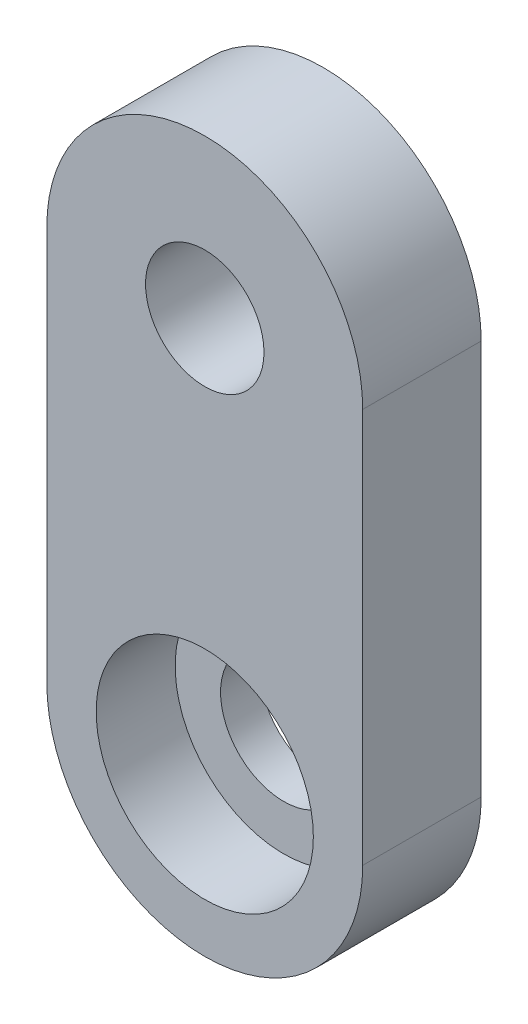
ISO-10303-21;
HEADER;
FILE_DESCRIPTION(('STEP AP214'),'2;1');
FILE_NAME('part.step','',(''),(''),'','','');
FILE_SCHEMA(('AUTOMOTIVE_DESIGN { 1 0 10303 214 1 1 1 1 }'));
ENDSEC;
DATA;
#1=APPLICATION_CONTEXT('core data for automotive mechanical design processes');
#2=APPLICATION_PROTOCOL_DEFINITION('international standard','automotive_design',2000,#1);
#3=PRODUCT_CONTEXT('',#1,'mechanical');
#4=PRODUCT('Part','Part','',(#3));
#5=PRODUCT_RELATED_PRODUCT_CATEGORY('part','',(#4));
#6=PRODUCT_DEFINITION_FORMATION('','',#4);
#7=PRODUCT_DEFINITION_CONTEXT('part definition',#1,'design');
#8=PRODUCT_DEFINITION('design','',#6,#7);
#9=PRODUCT_DEFINITION_SHAPE('','',#8);
#10=(LENGTH_UNIT() NAMED_UNIT(*) SI_UNIT(.MILLI.,.METRE.));
#11=(NAMED_UNIT(*) PLANE_ANGLE_UNIT() SI_UNIT($,.RADIAN.));
#12=(NAMED_UNIT(*) SI_UNIT($,.STERADIAN.) SOLID_ANGLE_UNIT());
#13=UNCERTAINTY_MEASURE_WITH_UNIT(LENGTH_MEASURE(1.E-05),#10,'distance_accuracy_value','');
#14=(GEOMETRIC_REPRESENTATION_CONTEXT(3) GLOBAL_UNCERTAINTY_ASSIGNED_CONTEXT((#13)) GLOBAL_UNIT_ASSIGNED_CONTEXT((#10,
#11,#12)) REPRESENTATION_CONTEXT('',''));
#15=CARTESIAN_POINT('',(0.,0.,0.));
#16=DIRECTION('',(0.,0.,1.));
#17=DIRECTION('',(1.,0.,0.));
#18=AXIS2_PLACEMENT_3D('',#15,#16,#17);
#19=CARTESIAN_POINT('',(0.,0.,-0.00100000000000013));
#20=DIRECTION('',(0.,0.,1.));
#21=DIRECTION('',(1.,0.,0.));
#22=AXIS2_PLACEMENT_3D('',#19,#20,#21);
#23=CYLINDRICAL_SURFACE('',#22,2.032);
#24=CARTESIAN_POINT('',(0.,0.,0.));
#25=DIRECTION('',(0.,0.,1.));
#26=DIRECTION('',(1.,0.,0.));
#27=AXIS2_PLACEMENT_3D('',#24,#25,#26);
#28=CIRCLE('',#27,2.032);
#29=CARTESIAN_POINT('',(2.032,0.,0.));
#30=VERTEX_POINT('',#29);
#31=EDGE_CURVE('E122',#30,#30,#28,.F.);
#32=ORIENTED_EDGE('',*,*,#31,.T.);
#33=EDGE_LOOP('',(#32));
#34=FACE_BOUND('',#33,.T.);
#35=CARTESIAN_POINT('',(0.,0.,1.27));
#36=DIRECTION('',(0.,0.,1.));
#37=DIRECTION('',(1.,0.,0.));
#38=AXIS2_PLACEMENT_3D('',#35,#36,#37);
#39=CIRCLE('',#38,2.032);
#40=CARTESIAN_POINT('',(2.032,0.,1.27));
#41=VERTEX_POINT('',#40);
#42=EDGE_CURVE('E51',#41,#41,#39,.F.);
#43=ORIENTED_EDGE('',*,*,#42,.F.);
#44=EDGE_LOOP('',(#43));
#45=FACE_BOUND('',#44,.T.);
#46=ADVANCED_FACE('F47',(#34,#45),#23,.F.);
#47=CARTESIAN_POINT('',(0.,0.,3.81));
#48=DIRECTION('',(0.,0.,-1.));
#49=DIRECTION('',(-1.,0.,0.));
#50=AXIS2_PLACEMENT_3D('',#47,#48,#49);
#51=CYLINDRICAL_SURFACE('',#50,5.08);
#52=CARTESIAN_POINT('',(0.,0.,0.));
#53=DIRECTION('',(0.,0.,1.));
#54=DIRECTION('',(1.,0.,0.));
#55=AXIS2_PLACEMENT_3D('',#52,#53,#54);
#56=CIRCLE('',#55,5.08);
#57=CARTESIAN_POINT('',(-5.08,0.,0.));
#58=VERTEX_POINT('',#57);
#59=CARTESIAN_POINT('',(5.08,0.,0.));
#60=VERTEX_POINT('',#59);
#61=EDGE_CURVE('E118',#58,#60,#56,.T.);
#62=ORIENTED_EDGE('',*,*,#61,.T.);
#63=DIRECTION('',(0.,0.,-1.));
#64=VECTOR('',#63,1.);
#65=CARTESIAN_POINT('',(5.08,0.,3.81));
#66=LINE('',#65,#64);
#67=CARTESIAN_POINT('',(5.08,0.,3.81));
#68=VERTEX_POINT('',#67);
#69=EDGE_CURVE('E12',#68,#60,#66,.T.);
#70=ORIENTED_EDGE('',*,*,#69,.F.);
#71=CARTESIAN_POINT('',(0.,0.,3.81));
#72=DIRECTION('',(0.,0.,1.));
#73=DIRECTION('',(1.,0.,0.));
#74=AXIS2_PLACEMENT_3D('',#71,#72,#73);
#75=CIRCLE('',#74,5.08);
#76=CARTESIAN_POINT('',(-5.08,0.,3.81));
#77=VERTEX_POINT('',#76);
#78=EDGE_CURVE('E101',#77,#68,#75,.T.);
#79=ORIENTED_EDGE('',*,*,#78,.F.);
#80=DIRECTION('',(0.,0.,-1.));
#81=VECTOR('',#80,1.);
#82=CARTESIAN_POINT('',(-5.08,0.,3.81));
#83=LINE('',#82,#81);
#84=EDGE_CURVE('E114',#77,#58,#83,.T.);
#85=ORIENTED_EDGE('',*,*,#84,.T.);
#86=EDGE_LOOP('',(#62,#70,#79,#85));
#87=FACE_BOUND('',#86,.T.);
#88=ADVANCED_FACE('F49',(#87),#51,.T.);
#89=CARTESIAN_POINT('',(5.08,0.,3.81));
#90=DIRECTION('',(-1.,0.,0.));
#91=DIRECTION('',(0.,0.,1.));
#92=AXIS2_PLACEMENT_3D('',#89,#90,#91);
#93=PLANE('',#92);
#94=DIRECTION('',(0.,1.,0.));
#95=VECTOR('',#94,1.);
#96=CARTESIAN_POINT('',(5.08,0.,0.));
#97=LINE('',#96,#95);
#98=CARTESIAN_POINT('',(5.08,12.7,0.));
#99=VERTEX_POINT('',#98);
#100=EDGE_CURVE('E106',#60,#99,#97,.T.);
#101=ORIENTED_EDGE('',*,*,#100,.T.);
#102=DIRECTION('',(0.,0.,-1.));
#103=VECTOR('',#102,1.);
#104=CARTESIAN_POINT('',(5.08,12.7,3.81));
#105=LINE('',#104,#103);
#106=CARTESIAN_POINT('',(5.08,12.7,3.81));
#107=VERTEX_POINT('',#106);
#108=EDGE_CURVE('E58',#107,#99,#105,.T.);
#109=ORIENTED_EDGE('',*,*,#108,.F.);
#110=DIRECTION('',(0.,1.,0.));
#111=VECTOR('',#110,1.);
#112=CARTESIAN_POINT('',(5.08,0.,3.81));
#113=LINE('',#112,#111);
#114=EDGE_CURVE('E96',#68,#107,#113,.T.);
#115=ORIENTED_EDGE('',*,*,#114,.F.);
#116=ORIENTED_EDGE('',*,*,#69,.T.);
#117=EDGE_LOOP('',(#101,#109,#115,#116));
#118=FACE_BOUND('',#117,.T.);
#119=ADVANCED_FACE('F105',(#118),#93,.F.);
#120=CARTESIAN_POINT('',(0.,12.7,3.81));
#121=DIRECTION('',(0.,0.,-1.));
#122=DIRECTION('',(-1.,0.,0.));
#123=AXIS2_PLACEMENT_3D('',#120,#121,#122);
#124=CYLINDRICAL_SURFACE('',#123,5.08);
#125=CARTESIAN_POINT('',(0.,12.7,0.));
#126=DIRECTION('',(0.,0.,1.));
#127=DIRECTION('',(1.,0.,0.));
#128=AXIS2_PLACEMENT_3D('',#125,#126,#127);
#129=CIRCLE('',#128,5.08);
#130=CARTESIAN_POINT('',(-5.08,12.7,0.));
#131=VERTEX_POINT('',#130);
#132=EDGE_CURVE('E83',#99,#131,#129,.T.);
#133=ORIENTED_EDGE('',*,*,#132,.T.);
#134=DIRECTION('',(0.,0.,-1.));
#135=VECTOR('',#134,1.);
#136=CARTESIAN_POINT('',(-5.08,12.7,3.81));
#137=LINE('',#136,#135);
#138=CARTESIAN_POINT('',(-5.08,12.7,3.81));
#139=VERTEX_POINT('',#138);
#140=EDGE_CURVE('E108',#139,#131,#137,.T.);
#141=ORIENTED_EDGE('',*,*,#140,.F.);
#142=CARTESIAN_POINT('',(0.,12.7,3.81));
#143=DIRECTION('',(0.,0.,1.));
#144=DIRECTION('',(1.,0.,0.));
#145=AXIS2_PLACEMENT_3D('',#142,#143,#144);
#146=CIRCLE('',#145,5.08);
#147=EDGE_CURVE('E99',#107,#139,#146,.T.);
#148=ORIENTED_EDGE('',*,*,#147,.F.);
#149=ORIENTED_EDGE('',*,*,#108,.T.);
#150=EDGE_LOOP('',(#133,#141,#148,#149));
#151=FACE_BOUND('',#150,.T.);
#152=ADVANCED_FACE('F110',(#151),#124,.T.);
#153=CARTESIAN_POINT('',(-5.08,0.,3.81));
#154=DIRECTION('',(1.,0.,0.));
#155=DIRECTION('',(0.,0.,-1.));
#156=AXIS2_PLACEMENT_3D('',#153,#154,#155);
#157=PLANE('',#156);
#158=DIRECTION('',(0.,-1.,0.));
#159=VECTOR('',#158,1.);
#160=CARTESIAN_POINT('',(-5.08,0.,0.));
#161=LINE('',#160,#159);
#162=EDGE_CURVE('E89',#131,#58,#161,.T.);
#163=ORIENTED_EDGE('',*,*,#162,.T.);
#164=ORIENTED_EDGE('',*,*,#84,.F.);
#165=DIRECTION('',(0.,-1.,0.));
#166=VECTOR('',#165,1.);
#167=CARTESIAN_POINT('',(-5.08,0.,3.81));
#168=LINE('',#167,#166);
#169=EDGE_CURVE('E66',#139,#77,#168,.T.);
#170=ORIENTED_EDGE('',*,*,#169,.F.);
#171=ORIENTED_EDGE('',*,*,#140,.T.);
#172=EDGE_LOOP('',(#163,#164,#170,#171));
#173=FACE_BOUND('',#172,.T.);
#174=ADVANCED_FACE('F132',(#173),#157,.F.);
#175=CARTESIAN_POINT('',(0.,0.,3.81));
#176=DIRECTION('',(0.,0.,1.));
#177=DIRECTION('',(1.,0.,0.));
#178=AXIS2_PLACEMENT_3D('',#175,#176,#177);
#179=PLANE('',#178);
#180=CARTESIAN_POINT('',(0.,0.,3.81));
#181=DIRECTION('',(0.,0.,1.));
#182=DIRECTION('',(1.,0.,0.));
#183=AXIS2_PLACEMENT_3D('',#180,#181,#182);
#184=CIRCLE('',#183,3.4925);
#185=CARTESIAN_POINT('',(3.4925,0.,3.81));
#186=VERTEX_POINT('',#185);
#187=EDGE_CURVE('E154',#186,#186,#184,.T.);
#188=ORIENTED_EDGE('',*,*,#187,.F.);
#189=EDGE_LOOP('',(#188));
#190=FACE_BOUND('',#189,.T.);
#191=CARTESIAN_POINT('',(0.,12.7,3.81));
#192=DIRECTION('',(0.,0.,1.));
#193=DIRECTION('',(1.,0.,0.));
#194=AXIS2_PLACEMENT_3D('',#191,#192,#193);
#195=CIRCLE('',#194,1.905);
#196=CARTESIAN_POINT('',(1.905,12.7,3.81));
#197=VERTEX_POINT('',#196);
#198=EDGE_CURVE('E139',#197,#197,#195,.T.);
#199=ORIENTED_EDGE('',*,*,#198,.F.);
#200=EDGE_LOOP('',(#199));
#201=FACE_BOUND('',#200,.T.);
#202=ORIENTED_EDGE('',*,*,#78,.T.);
#203=ORIENTED_EDGE('',*,*,#114,.T.);
#204=ORIENTED_EDGE('',*,*,#147,.T.);
#205=ORIENTED_EDGE('',*,*,#169,.T.);
#206=EDGE_LOOP('',(#202,#203,#204,#205));
#207=FACE_BOUND('',#206,.T.);
#208=ADVANCED_FACE('F97',(#190,#201,#207),#179,.T.);
#209=CARTESIAN_POINT('',(0.,0.,0.));
#210=DIRECTION('',(0.,0.,1.));
#211=DIRECTION('',(1.,0.,0.));
#212=AXIS2_PLACEMENT_3D('',#209,#210,#211);
#213=PLANE('',#212);
#214=ORIENTED_EDGE('',*,*,#31,.F.);
#215=EDGE_LOOP('',(#214));
#216=FACE_BOUND('',#215,.T.);
#217=CARTESIAN_POINT('',(0.,12.7,0.));
#218=DIRECTION('',(0.,0.,1.));
#219=DIRECTION('',(1.,0.,0.));
#220=AXIS2_PLACEMENT_3D('',#217,#218,#219);
#221=CIRCLE('',#220,1.905);
#222=CARTESIAN_POINT('',(1.905,12.7,0.));
#223=VERTEX_POINT('',#222);
#224=EDGE_CURVE('E143',#223,#223,#221,.F.);
#225=ORIENTED_EDGE('',*,*,#224,.F.);
#226=EDGE_LOOP('',(#225));
#227=FACE_BOUND('',#226,.T.);
#228=ORIENTED_EDGE('',*,*,#61,.F.);
#229=ORIENTED_EDGE('',*,*,#162,.F.);
#230=ORIENTED_EDGE('',*,*,#132,.F.);
#231=ORIENTED_EDGE('',*,*,#100,.F.);
#232=EDGE_LOOP('',(#228,#229,#230,#231));
#233=FACE_BOUND('',#232,.T.);
#234=ADVANCED_FACE('F135',(#216,#227,#233),#213,.F.);
#235=CARTESIAN_POINT('',(0.,12.7,-0.00100000000000013));
#236=DIRECTION('',(0.,0.,1.));
#237=DIRECTION('',(1.,0.,0.));
#238=AXIS2_PLACEMENT_3D('',#235,#236,#237);
#239=CYLINDRICAL_SURFACE('',#238,1.905);
#240=ORIENTED_EDGE('',*,*,#198,.T.);
#241=EDGE_LOOP('',(#240));
#242=FACE_BOUND('',#241,.T.);
#243=ORIENTED_EDGE('',*,*,#224,.T.);
#244=EDGE_LOOP('',(#243));
#245=FACE_BOUND('',#244,.T.);
#246=ADVANCED_FACE('F166',(#242,#245),#239,.F.);
#247=CARTESIAN_POINT('',(0.,0.,1.27));
#248=DIRECTION('',(0.,0.,1.));
#249=DIRECTION('',(1.,0.,0.));
#250=AXIS2_PLACEMENT_3D('',#247,#248,#249);
#251=PLANE('',#250);
#252=CARTESIAN_POINT('',(0.,0.,1.27));
#253=DIRECTION('',(0.,0.,1.));
#254=DIRECTION('',(1.,0.,0.));
#255=AXIS2_PLACEMENT_3D('',#252,#253,#254);
#256=CIRCLE('',#255,3.4925);
#257=CARTESIAN_POINT('',(3.4925,0.,1.27));
#258=VERTEX_POINT('',#257);
#259=EDGE_CURVE('E150',#258,#258,#256,.F.);
#260=ORIENTED_EDGE('',*,*,#259,.F.);
#261=EDGE_LOOP('',(#260));
#262=FACE_BOUND('',#261,.T.);
#263=ORIENTED_EDGE('',*,*,#42,.T.);
#264=EDGE_LOOP('',(#263));
#265=FACE_BOUND('',#264,.T.);
#266=ADVANCED_FACE('F169',(#262,#265),#251,.T.);
#267=CARTESIAN_POINT('',(0.,0.,-9.87828173317607));
#268=DIRECTION('',(0.,0.,1.));
#269=DIRECTION('',(1.,0.,0.));
#270=AXIS2_PLACEMENT_3D('',#267,#268,#269);
#271=CYLINDRICAL_SURFACE('',#270,3.4925);
#272=CARTESIAN_POINT('',(3.4925,0.,1.27));
#273=CARTESIAN_POINT('',(3.4925,0.,1.29645833333333));
#274=CARTESIAN_POINT('',(3.4925,0.,1.32291666666667));
#275=CARTESIAN_POINT('',(3.4925,0.,1.37583333333333));
#276=CARTESIAN_POINT('',(3.4925,0.,1.40229166666667));
#277=CARTESIAN_POINT('',(3.4925,0.,1.45520833333333));
#278=CARTESIAN_POINT('',(3.4925,0.,1.48166666666667));
#279=CARTESIAN_POINT('',(3.4925,0.,1.53458333333333));
#280=CARTESIAN_POINT('',(3.4925,0.,1.56104166666667));
#281=CARTESIAN_POINT('',(3.4925,0.,1.61395833333333));
#282=CARTESIAN_POINT('',(3.4925,0.,1.64041666666667));
#283=CARTESIAN_POINT('',(3.4925,0.,1.69333333333333));
#284=CARTESIAN_POINT('',(3.4925,0.,1.71979166666667));
#285=CARTESIAN_POINT('',(3.4925,0.,1.77270833333333));
#286=CARTESIAN_POINT('',(3.4925,0.,1.79916666666667));
#287=CARTESIAN_POINT('',(3.4925,0.,1.85208333333333));
#288=CARTESIAN_POINT('',(3.4925,0.,1.87854166666667));
#289=CARTESIAN_POINT('',(3.4925,0.,1.93145833333333));
#290=CARTESIAN_POINT('',(3.4925,0.,1.95791666666667));
#291=CARTESIAN_POINT('',(3.4925,0.,2.01083333333333));
#292=CARTESIAN_POINT('',(3.4925,0.,2.03729166666667));
#293=CARTESIAN_POINT('',(3.4925,0.,2.09020833333333));
#294=CARTESIAN_POINT('',(3.4925,0.,2.11666666666667));
#295=CARTESIAN_POINT('',(3.4925,0.,2.16958333333333));
#296=CARTESIAN_POINT('',(3.4925,0.,2.19604166666667));
#297=CARTESIAN_POINT('',(3.4925,0.,2.24895833333333));
#298=CARTESIAN_POINT('',(3.4925,0.,2.27541666666667));
#299=CARTESIAN_POINT('',(3.4925,0.,2.32833333333333));
#300=CARTESIAN_POINT('',(3.4925,0.,2.35479166666667));
#301=CARTESIAN_POINT('',(3.4925,0.,2.40770833333333));
#302=CARTESIAN_POINT('',(3.4925,0.,2.43416666666667));
#303=CARTESIAN_POINT('',(3.4925,0.,2.48708333333333));
#304=CARTESIAN_POINT('',(3.4925,0.,2.51354166666667));
#305=CARTESIAN_POINT('',(3.4925,0.,2.56645833333333));
#306=CARTESIAN_POINT('',(3.4925,0.,2.59291666666667));
#307=CARTESIAN_POINT('',(3.4925,0.,2.64583333333333));
#308=CARTESIAN_POINT('',(3.4925,0.,2.67229166666667));
#309=CARTESIAN_POINT('',(3.4925,0.,2.72520833333333));
#310=CARTESIAN_POINT('',(3.4925,0.,2.75166666666667));
#311=CARTESIAN_POINT('',(3.4925,0.,2.80458333333333));
#312=CARTESIAN_POINT('',(3.4925,0.,2.83104166666667));
#313=CARTESIAN_POINT('',(3.4925,0.,2.88395833333333));
#314=CARTESIAN_POINT('',(3.4925,0.,2.91041666666667));
#315=CARTESIAN_POINT('',(3.4925,0.,2.96333333333333));
#316=CARTESIAN_POINT('',(3.4925,0.,2.98979166666667));
#317=CARTESIAN_POINT('',(3.4925,0.,3.04270833333333));
#318=CARTESIAN_POINT('',(3.4925,0.,3.06916666666667));
#319=CARTESIAN_POINT('',(3.4925,0.,3.12208333333333));
#320=CARTESIAN_POINT('',(3.4925,0.,3.14854166666667));
#321=CARTESIAN_POINT('',(3.4925,0.,3.20145833333333));
#322=CARTESIAN_POINT('',(3.4925,0.,3.22791666666667));
#323=CARTESIAN_POINT('',(3.4925,0.,3.28083333333333));
#324=CARTESIAN_POINT('',(3.4925,0.,3.30729166666667));
#325=CARTESIAN_POINT('',(3.4925,0.,3.36020833333333));
#326=CARTESIAN_POINT('',(3.4925,0.,3.38666666666667));
#327=CARTESIAN_POINT('',(3.4925,0.,3.43958333333333));
#328=CARTESIAN_POINT('',(3.4925,0.,3.46604166666667));
#329=CARTESIAN_POINT('',(3.4925,0.,3.51895833333333));
#330=CARTESIAN_POINT('',(3.4925,0.,3.54541666666667));
#331=CARTESIAN_POINT('',(3.4925,0.,3.59833333333333));
#332=CARTESIAN_POINT('',(3.4925,0.,3.62479166666667));
#333=CARTESIAN_POINT('',(3.4925,0.,3.67770833333334));
#334=CARTESIAN_POINT('',(3.4925,0.,3.70416666666667));
#335=CARTESIAN_POINT('',(3.4925,0.,3.75708333333333));
#336=CARTESIAN_POINT('',(3.4925,0.,3.78354166666667));
#337=CARTESIAN_POINT('',(3.4925,0.,3.81));
#338=B_SPLINE_CURVE_WITH_KNOTS('',3,(#272,#273,#274,#275,#276,#277,#278,#279,#280,#281,#282,
#283,#284,#285,#286,#287,#288,#289,#290,#291,#292,#293,#294,#295,#296,#297,#298,#299,#300,#301,
#302,#303,#304,#305,#306,#307,#308,#309,#310,#311,#312,#313,#314,#315,#316,#317,#318,#319,#320,
#321,#322,#323,#324,#325,#326,#327,#328,#329,#330,#331,#332,#333,#334,#335,#336,#337),
.UNSPECIFIED.,.F.,.F.,(4,2,2,2,2,2,2,2,2,2,2,2,2,2,2,2,2,2,2,2,2,2,2,2,2,2,2,2,2,2,2,2,4),(0.,
0.0793749999999996,0.158749999999999,0.238125,0.3175,0.396875,0.476250000000001,
0.555625000000001,0.635,0.714375,0.793749999999999,0.873125000000001,0.9525,1.031875,1.11125,
1.190625,1.27,1.349375,1.42875,1.508125,1.5875,1.666875,1.74625,1.825625,1.905,1.984375,2.06375,
2.143125,2.2225,2.301875,2.38125,2.460625,2.54),.UNSPECIFIED.);
#339=EDGE_CURVE('BSEAM159',#258,#186,#338,.T.);
#340=ORIENTED_EDGE('',*,*,#259,.T.);
#341=ORIENTED_EDGE('',*,*,#187,.T.);
#342=ORIENTED_EDGE('',*,*,#339,.T.);
#343=ORIENTED_EDGE('',*,*,#339,.F.);
#344=EDGE_LOOP('',(#340,#342,#341,#343));
#345=FACE_BOUND('',#344,.T.);
#346=ADVANCED_FACE('F159',(#345),#271,.F.);
#347=CLOSED_SHELL('',(#46,#88,#119,#152,#174,#208,#234,#246,#266,#346));
#348=MANIFOLD_SOLID_BREP('B2',#347);
#349=ADVANCED_BREP_SHAPE_REPRESENTATION('',(#18,#348),#14);
#350=SHAPE_DEFINITION_REPRESENTATION(#9,#349);
ENDSEC;
END-ISO-10303-21;
